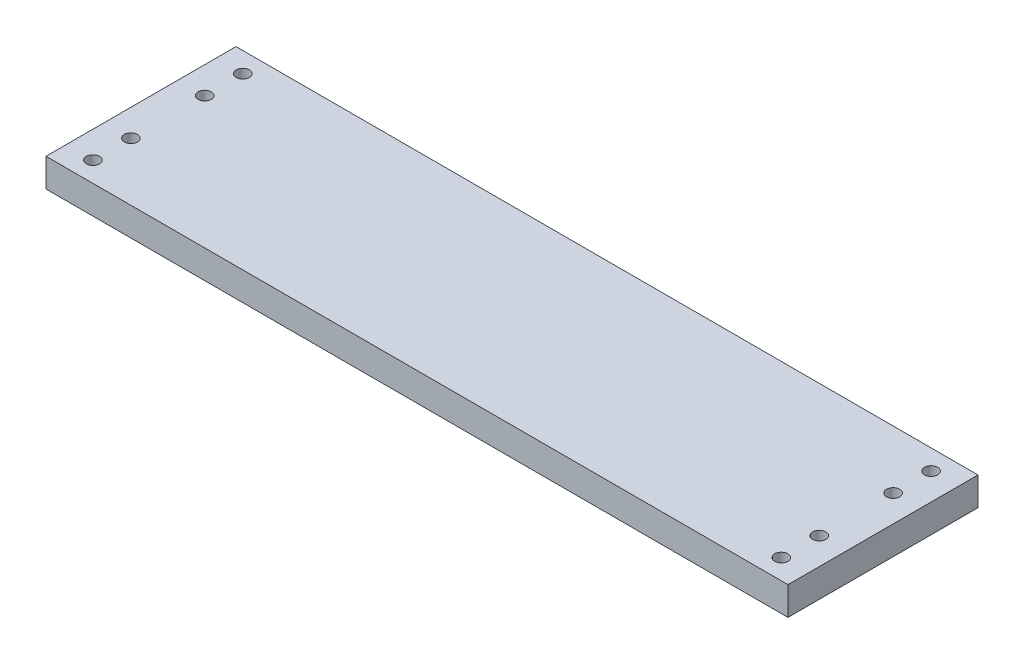
ISO-10303-21;
HEADER;
FILE_DESCRIPTION(('STEP AP214'),'2;1');
FILE_NAME('part.step','',(''),(''),'','','');
FILE_SCHEMA(('AUTOMOTIVE_DESIGN { 1 0 10303 214 1 1 1 1 }'));
ENDSEC;
DATA;
#1=APPLICATION_CONTEXT('core data for automotive mechanical design processes');
#2=APPLICATION_PROTOCOL_DEFINITION('international standard','automotive_design',2000,#1);
#3=PRODUCT_CONTEXT('',#1,'mechanical');
#4=PRODUCT('Part','Part','',(#3));
#5=PRODUCT_RELATED_PRODUCT_CATEGORY('part','',(#4));
#6=PRODUCT_DEFINITION_FORMATION('','',#4);
#7=PRODUCT_DEFINITION_CONTEXT('part definition',#1,'design');
#8=PRODUCT_DEFINITION('design','',#6,#7);
#9=PRODUCT_DEFINITION_SHAPE('','',#8);
#10=(LENGTH_UNIT() NAMED_UNIT(*) SI_UNIT(.MILLI.,.METRE.));
#11=(NAMED_UNIT(*) PLANE_ANGLE_UNIT() SI_UNIT($,.RADIAN.));
#12=(NAMED_UNIT(*) SI_UNIT($,.STERADIAN.) SOLID_ANGLE_UNIT());
#13=UNCERTAINTY_MEASURE_WITH_UNIT(LENGTH_MEASURE(1.E-05),#10,'distance_accuracy_value','');
#14=(GEOMETRIC_REPRESENTATION_CONTEXT(3) GLOBAL_UNCERTAINTY_ASSIGNED_CONTEXT((#13)) GLOBAL_UNIT_ASSIGNED_CONTEXT((#10,
#11,#12)) REPRESENTATION_CONTEXT('',''));
#15=CARTESIAN_POINT('',(0.,0.,0.));
#16=DIRECTION('',(0.,0.,1.));
#17=DIRECTION('',(1.,0.,0.));
#18=AXIS2_PLACEMENT_3D('',#15,#16,#17);
#19=CARTESIAN_POINT('',(-83.,6.35,-21.255));
#20=DIRECTION('',(0.,0.,-1.));
#21=DIRECTION('',(-1.,0.,0.));
#22=AXIS2_PLACEMENT_3D('',#19,#20,#21);
#23=PLANE('',#22);
#24=DIRECTION('',(1.,0.,0.));
#25=VECTOR('',#24,1.);
#26=CARTESIAN_POINT('',(-83.,0.,-21.255));
#27=LINE('',#26,#25);
#28=CARTESIAN_POINT('',(-83.,0.,-21.255));
#29=VERTEX_POINT('',#28);
#30=CARTESIAN_POINT('',(83.,0.,-21.255));
#31=VERTEX_POINT('',#30);
#32=EDGE_CURVE('E99',#29,#31,#27,.T.);
#33=ORIENTED_EDGE('',*,*,#32,.F.);
#34=DIRECTION('',(0.,-1.,0.));
#35=VECTOR('',#34,1.);
#36=CARTESIAN_POINT('',(-83.,6.35,-21.255));
#37=LINE('',#36,#35);
#38=CARTESIAN_POINT('',(-83.,6.35,-21.255));
#39=VERTEX_POINT('',#38);
#40=EDGE_CURVE('E11',#39,#29,#37,.T.);
#41=ORIENTED_EDGE('',*,*,#40,.F.);
#42=DIRECTION('',(1.,0.,0.));
#43=VECTOR('',#42,1.);
#44=CARTESIAN_POINT('',(-83.,6.35,-21.255));
#45=LINE('',#44,#43);
#46=CARTESIAN_POINT('',(83.,6.35,-21.255));
#47=VERTEX_POINT('',#46);
#48=EDGE_CURVE('E93',#39,#47,#45,.T.);
#49=ORIENTED_EDGE('',*,*,#48,.T.);
#50=DIRECTION('',(0.,-1.,0.));
#51=VECTOR('',#50,1.);
#52=CARTESIAN_POINT('',(83.,6.35,-21.255));
#53=LINE('',#52,#51);
#54=EDGE_CURVE('E36',#47,#31,#53,.T.);
#55=ORIENTED_EDGE('',*,*,#54,.T.);
#56=EDGE_LOOP('',(#33,#41,#49,#55));
#57=FACE_BOUND('',#56,.T.);
#58=ADVANCED_FACE('F33',(#57),#23,.T.);
#59=CARTESIAN_POINT('',(-83.,6.35,-21.255));
#60=DIRECTION('',(1.,0.,0.));
#61=DIRECTION('',(0.,0.,-1.));
#62=AXIS2_PLACEMENT_3D('',#59,#60,#61);
#63=PLANE('',#62);
#64=DIRECTION('',(0.,0.,1.));
#65=VECTOR('',#64,1.);
#66=CARTESIAN_POINT('',(-83.,0.,-21.255));
#67=LINE('',#66,#65);
#68=CARTESIAN_POINT('',(-83.,0.,21.255));
#69=VERTEX_POINT('',#68);
#70=EDGE_CURVE('E66',#29,#69,#67,.T.);
#71=ORIENTED_EDGE('',*,*,#70,.T.);
#72=DIRECTION('',(0.,-1.,0.));
#73=VECTOR('',#72,1.);
#74=CARTESIAN_POINT('',(-83.,6.35,21.255));
#75=LINE('',#74,#73);
#76=CARTESIAN_POINT('',(-83.,6.35,21.255));
#77=VERTEX_POINT('',#76);
#78=EDGE_CURVE('E42',#77,#69,#75,.T.);
#79=ORIENTED_EDGE('',*,*,#78,.F.);
#80=DIRECTION('',(0.,0.,1.));
#81=VECTOR('',#80,1.);
#82=CARTESIAN_POINT('',(-83.,6.35,-21.255));
#83=LINE('',#82,#81);
#84=EDGE_CURVE('E83',#39,#77,#83,.T.);
#85=ORIENTED_EDGE('',*,*,#84,.F.);
#86=ORIENTED_EDGE('',*,*,#40,.T.);
#87=EDGE_LOOP('',(#71,#79,#85,#86));
#88=FACE_BOUND('',#87,.T.);
#89=ADVANCED_FACE('F110',(#88),#63,.F.);
#90=CARTESIAN_POINT('',(-83.,6.35,21.255));
#91=DIRECTION('',(0.,0.,-1.));
#92=DIRECTION('',(-1.,0.,0.));
#93=AXIS2_PLACEMENT_3D('',#90,#91,#92);
#94=PLANE('',#93);
#95=DIRECTION('',(1.,0.,0.));
#96=VECTOR('',#95,1.);
#97=CARTESIAN_POINT('',(-83.,0.,21.255));
#98=LINE('',#97,#96);
#99=CARTESIAN_POINT('',(83.,0.,21.255));
#100=VERTEX_POINT('',#99);
#101=EDGE_CURVE('E90',#69,#100,#98,.T.);
#102=ORIENTED_EDGE('',*,*,#101,.T.);
#103=DIRECTION('',(0.,-1.,0.));
#104=VECTOR('',#103,1.);
#105=CARTESIAN_POINT('',(83.,6.35,21.255));
#106=LINE('',#105,#104);
#107=CARTESIAN_POINT('',(83.,6.35,21.255));
#108=VERTEX_POINT('',#107);
#109=EDGE_CURVE('E87',#108,#100,#106,.T.);
#110=ORIENTED_EDGE('',*,*,#109,.F.);
#111=DIRECTION('',(1.,0.,0.));
#112=VECTOR('',#111,1.);
#113=CARTESIAN_POINT('',(-83.,6.35,21.255));
#114=LINE('',#113,#112);
#115=EDGE_CURVE('E78',#77,#108,#114,.T.);
#116=ORIENTED_EDGE('',*,*,#115,.F.);
#117=ORIENTED_EDGE('',*,*,#78,.T.);
#118=EDGE_LOOP('',(#102,#110,#116,#117));
#119=FACE_BOUND('',#118,.T.);
#120=ADVANCED_FACE('F88',(#119),#94,.F.);
#121=CARTESIAN_POINT('',(83.,6.35,-21.255));
#122=DIRECTION('',(1.,0.,0.));
#123=DIRECTION('',(0.,0.,-1.));
#124=AXIS2_PLACEMENT_3D('',#121,#122,#123);
#125=PLANE('',#124);
#126=DIRECTION('',(0.,0.,1.));
#127=VECTOR('',#126,1.);
#128=CARTESIAN_POINT('',(83.,0.,-21.255));
#129=LINE('',#128,#127);
#130=EDGE_CURVE('E102',#31,#100,#129,.T.);
#131=ORIENTED_EDGE('',*,*,#130,.F.);
#132=ORIENTED_EDGE('',*,*,#54,.F.);
#133=DIRECTION('',(0.,0.,1.));
#134=VECTOR('',#133,1.);
#135=CARTESIAN_POINT('',(83.,6.35,-21.255));
#136=LINE('',#135,#134);
#137=EDGE_CURVE('E82',#47,#108,#136,.T.);
#138=ORIENTED_EDGE('',*,*,#137,.T.);
#139=ORIENTED_EDGE('',*,*,#109,.T.);
#140=EDGE_LOOP('',(#131,#132,#138,#139));
#141=FACE_BOUND('',#140,.T.);
#142=ADVANCED_FACE('F92',(#141),#125,.T.);
#143=CARTESIAN_POINT('',(0.,6.35,0.));
#144=DIRECTION('',(0.,-1.,0.));
#145=DIRECTION('',(0.,0.,-1.));
#146=AXIS2_PLACEMENT_3D('',#143,#144,#145);
#147=PLANE('',#146);
#148=CARTESIAN_POINT('',(-77.,6.35,8.25499999999999));
#149=DIRECTION('',(0.,-1.,0.));
#150=DIRECTION('',(0.,0.,-1.));
#151=AXIS2_PLACEMENT_3D('',#148,#149,#150);
#152=CIRCLE('',#151,1.47319999999999);
#153=CARTESIAN_POINT('',(-77.,6.35,6.7818));
#154=VERTEX_POINT('',#153);
#155=EDGE_CURVE('E206',#154,#154,#152,.T.);
#156=ORIENTED_EDGE('',*,*,#155,.T.);
#157=EDGE_LOOP('',(#156));
#158=FACE_BOUND('',#157,.T.);
#159=CARTESIAN_POINT('',(-77.,6.35,16.755));
#160=DIRECTION('',(0.,-1.,0.));
#161=DIRECTION('',(0.,0.,-1.));
#162=AXIS2_PLACEMENT_3D('',#159,#160,#161);
#163=CIRCLE('',#162,1.47319999999999);
#164=CARTESIAN_POINT('',(-77.,6.35,15.2818));
#165=VERTEX_POINT('',#164);
#166=EDGE_CURVE('E216',#165,#165,#163,.T.);
#167=ORIENTED_EDGE('',*,*,#166,.T.);
#168=EDGE_LOOP('',(#167));
#169=FACE_BOUND('',#168,.T.);
#170=CARTESIAN_POINT('',(77.,6.35,8.25500000000001));
#171=DIRECTION('',(0.,-1.,0.));
#172=DIRECTION('',(0.,0.,-1.));
#173=AXIS2_PLACEMENT_3D('',#170,#171,#172);
#174=CIRCLE('',#173,1.47319999999999);
#175=CARTESIAN_POINT('',(77.,6.35,6.78180000000001));
#176=VERTEX_POINT('',#175);
#177=EDGE_CURVE('E225',#176,#176,#174,.T.);
#178=ORIENTED_EDGE('',*,*,#177,.T.);
#179=EDGE_LOOP('',(#178));
#180=FACE_BOUND('',#179,.T.);
#181=CARTESIAN_POINT('',(77.,6.35,16.755));
#182=DIRECTION('',(0.,-1.,0.));
#183=DIRECTION('',(0.,0.,-1.));
#184=AXIS2_PLACEMENT_3D('',#181,#182,#183);
#185=CIRCLE('',#184,1.47319999999999);
#186=CARTESIAN_POINT('',(77.,6.35,15.2818));
#187=VERTEX_POINT('',#186);
#188=EDGE_CURVE('E234',#187,#187,#185,.T.);
#189=ORIENTED_EDGE('',*,*,#188,.T.);
#190=EDGE_LOOP('',(#189));
#191=FACE_BOUND('',#190,.T.);
#192=CARTESIAN_POINT('',(-77.,6.35,-8.25499999999999));
#193=DIRECTION('',(0.,1.,0.));
#194=DIRECTION('',(0.,0.,1.));
#195=AXIS2_PLACEMENT_3D('',#192,#193,#194);
#196=CIRCLE('',#195,1.47319999999999);
#197=CARTESIAN_POINT('',(-77.,6.35,-6.7818));
#198=VERTEX_POINT('',#197);
#199=EDGE_CURVE('E261',#198,#198,#196,.T.);
#200=ORIENTED_EDGE('',*,*,#199,.F.);
#201=EDGE_LOOP('',(#200));
#202=FACE_BOUND('',#201,.T.);
#203=CARTESIAN_POINT('',(-77.,6.35,-16.755));
#204=DIRECTION('',(0.,1.,0.));
#205=DIRECTION('',(0.,0.,1.));
#206=AXIS2_PLACEMENT_3D('',#203,#204,#205);
#207=CIRCLE('',#206,1.47319999999999);
#208=CARTESIAN_POINT('',(-77.,6.35,-15.2818));
#209=VERTEX_POINT('',#208);
#210=EDGE_CURVE('E264',#209,#209,#207,.T.);
#211=ORIENTED_EDGE('',*,*,#210,.F.);
#212=EDGE_LOOP('',(#211));
#213=FACE_BOUND('',#212,.T.);
#214=CARTESIAN_POINT('',(77.,6.35,-8.25500000000001));
#215=DIRECTION('',(0.,1.,0.));
#216=DIRECTION('',(0.,0.,1.));
#217=AXIS2_PLACEMENT_3D('',#214,#215,#216);
#218=CIRCLE('',#217,1.47319999999999);
#219=CARTESIAN_POINT('',(77.,6.35,-6.78180000000001));
#220=VERTEX_POINT('',#219);
#221=EDGE_CURVE('E267',#220,#220,#218,.T.);
#222=ORIENTED_EDGE('',*,*,#221,.F.);
#223=EDGE_LOOP('',(#222));
#224=FACE_BOUND('',#223,.T.);
#225=CARTESIAN_POINT('',(77.,6.35,-16.755));
#226=DIRECTION('',(0.,1.,0.));
#227=DIRECTION('',(0.,0.,1.));
#228=AXIS2_PLACEMENT_3D('',#225,#226,#227);
#229=CIRCLE('',#228,1.47319999999999);
#230=CARTESIAN_POINT('',(77.,6.35,-15.2818));
#231=VERTEX_POINT('',#230);
#232=EDGE_CURVE('E103',#231,#231,#229,.T.);
#233=ORIENTED_EDGE('',*,*,#232,.F.);
#234=EDGE_LOOP('',(#233));
#235=FACE_BOUND('',#234,.T.);
#236=ORIENTED_EDGE('',*,*,#48,.F.);
#237=ORIENTED_EDGE('',*,*,#84,.T.);
#238=ORIENTED_EDGE('',*,*,#115,.T.);
#239=ORIENTED_EDGE('',*,*,#137,.F.);
#240=EDGE_LOOP('',(#236,#237,#238,#239));
#241=FACE_BOUND('',#240,.T.);
#242=ADVANCED_FACE('F81',(#158,#169,#180,#191,#202,#213,#224,#235,#241),#147,.F.);
#243=CARTESIAN_POINT('',(0.,0.,0.));
#244=DIRECTION('',(0.,-1.,0.));
#245=DIRECTION('',(0.,0.,-1.));
#246=AXIS2_PLACEMENT_3D('',#243,#244,#245);
#247=PLANE('',#246);
#248=CARTESIAN_POINT('',(-77.,0.,8.25499999999999));
#249=DIRECTION('',(0.,-1.,0.));
#250=DIRECTION('',(0.,0.,-1.));
#251=AXIS2_PLACEMENT_3D('',#248,#249,#250);
#252=CIRCLE('',#251,3.4558351);
#253=CARTESIAN_POINT('',(-77.,0.,4.79916489999999));
#254=VERTEX_POINT('',#253);
#255=EDGE_CURVE('E204',#254,#254,#252,.T.);
#256=ORIENTED_EDGE('',*,*,#255,.F.);
#257=EDGE_LOOP('',(#256));
#258=FACE_BOUND('',#257,.T.);
#259=CARTESIAN_POINT('',(-77.,0.,16.755));
#260=DIRECTION('',(0.,-1.,0.));
#261=DIRECTION('',(0.,0.,-1.));
#262=AXIS2_PLACEMENT_3D('',#259,#260,#261);
#263=CIRCLE('',#262,3.4558351);
#264=CARTESIAN_POINT('',(-77.,0.,13.2991649));
#265=VERTEX_POINT('',#264);
#266=EDGE_CURVE('E210',#265,#265,#263,.T.);
#267=ORIENTED_EDGE('',*,*,#266,.F.);
#268=EDGE_LOOP('',(#267));
#269=FACE_BOUND('',#268,.T.);
#270=CARTESIAN_POINT('',(77.,0.,8.25500000000001));
#271=DIRECTION('',(0.,-1.,0.));
#272=DIRECTION('',(0.,0.,-1.));
#273=AXIS2_PLACEMENT_3D('',#270,#271,#272);
#274=CIRCLE('',#273,3.4558351);
#275=CARTESIAN_POINT('',(77.,0.,4.79916490000001));
#276=VERTEX_POINT('',#275);
#277=EDGE_CURVE('E219',#276,#276,#274,.T.);
#278=ORIENTED_EDGE('',*,*,#277,.F.);
#279=EDGE_LOOP('',(#278));
#280=FACE_BOUND('',#279,.T.);
#281=CARTESIAN_POINT('',(77.,0.,16.755));
#282=DIRECTION('',(0.,-1.,0.));
#283=DIRECTION('',(0.,0.,-1.));
#284=AXIS2_PLACEMENT_3D('',#281,#282,#283);
#285=CIRCLE('',#284,3.4558351);
#286=CARTESIAN_POINT('',(77.,0.,13.2991649));
#287=VERTEX_POINT('',#286);
#288=EDGE_CURVE('E228',#287,#287,#285,.T.);
#289=ORIENTED_EDGE('',*,*,#288,.F.);
#290=EDGE_LOOP('',(#289));
#291=FACE_BOUND('',#290,.T.);
#292=CARTESIAN_POINT('',(-77.,0.,-8.25499999999999));
#293=DIRECTION('',(0.,-1.,0.));
#294=DIRECTION('',(0.,0.,-1.));
#295=AXIS2_PLACEMENT_3D('',#292,#293,#294);
#296=CIRCLE('',#295,3.4558351);
#297=CARTESIAN_POINT('',(-77.,0.,-11.7108351));
#298=VERTEX_POINT('',#297);
#299=EDGE_CURVE('E237',#298,#298,#296,.T.);
#300=ORIENTED_EDGE('',*,*,#299,.F.);
#301=EDGE_LOOP('',(#300));
#302=FACE_BOUND('',#301,.T.);
#303=CARTESIAN_POINT('',(-77.,0.,-16.755));
#304=DIRECTION('',(0.,-1.,0.));
#305=DIRECTION('',(0.,0.,-1.));
#306=AXIS2_PLACEMENT_3D('',#303,#304,#305);
#307=CIRCLE('',#306,3.4558351);
#308=CARTESIAN_POINT('',(-77.,0.,-20.2108351));
#309=VERTEX_POINT('',#308);
#310=EDGE_CURVE('E243',#309,#309,#307,.T.);
#311=ORIENTED_EDGE('',*,*,#310,.F.);
#312=EDGE_LOOP('',(#311));
#313=FACE_BOUND('',#312,.T.);
#314=CARTESIAN_POINT('',(77.,0.,-8.25500000000001));
#315=DIRECTION('',(0.,-1.,0.));
#316=DIRECTION('',(0.,0.,-1.));
#317=AXIS2_PLACEMENT_3D('',#314,#315,#316);
#318=CIRCLE('',#317,3.4558351);
#319=CARTESIAN_POINT('',(77.,0.,-11.7108351));
#320=VERTEX_POINT('',#319);
#321=EDGE_CURVE('E249',#320,#320,#318,.T.);
#322=ORIENTED_EDGE('',*,*,#321,.F.);
#323=EDGE_LOOP('',(#322));
#324=FACE_BOUND('',#323,.T.);
#325=CARTESIAN_POINT('',(77.,0.,-16.755));
#326=DIRECTION('',(0.,-1.,0.));
#327=DIRECTION('',(0.,0.,-1.));
#328=AXIS2_PLACEMENT_3D('',#325,#326,#327);
#329=CIRCLE('',#328,3.4558351);
#330=CARTESIAN_POINT('',(77.,0.,-20.2108351));
#331=VERTEX_POINT('',#330);
#332=EDGE_CURVE('E255',#331,#331,#329,.T.);
#333=ORIENTED_EDGE('',*,*,#332,.F.);
#334=EDGE_LOOP('',(#333));
#335=FACE_BOUND('',#334,.T.);
#336=ORIENTED_EDGE('',*,*,#32,.T.);
#337=ORIENTED_EDGE('',*,*,#130,.T.);
#338=ORIENTED_EDGE('',*,*,#101,.F.);
#339=ORIENTED_EDGE('',*,*,#70,.F.);
#340=EDGE_LOOP('',(#336,#337,#338,#339));
#341=FACE_BOUND('',#340,.T.);
#342=ADVANCED_FACE('F108',(#258,#269,#280,#291,#302,#313,#324,#335,#341),#247,.T.);
#343=CARTESIAN_POINT('',(77.,6.35,-16.755));
#344=DIRECTION('',(0.,1.,0.));
#345=DIRECTION('',(0.,0.,1.));
#346=AXIS2_PLACEMENT_3D('',#343,#344,#345);
#347=CYLINDRICAL_SURFACE('',#346,1.47319999999999);
#348=CARTESIAN_POINT('',(77.,2.28076078208747,-16.755));
#349=DIRECTION('',(0.,-1.,0.));
#350=DIRECTION('',(0.,0.,-1.));
#351=AXIS2_PLACEMENT_3D('',#348,#349,#350);
#352=CIRCLE('',#351,1.47319999999999);
#353=CARTESIAN_POINT('',(77.,2.28076078208747,-18.2282));
#354=VERTEX_POINT('',#353);
#355=EDGE_CURVE('E258',#354,#354,#352,.T.);
#356=ORIENTED_EDGE('',*,*,#355,.T.);
#357=EDGE_LOOP('',(#356));
#358=FACE_BOUND('',#357,.T.);
#359=ORIENTED_EDGE('',*,*,#232,.T.);
#360=EDGE_LOOP('',(#359));
#361=FACE_BOUND('',#360,.T.);
#362=ADVANCED_FACE('F129',(#358,#361),#347,.F.);
#363=CARTESIAN_POINT('',(77.,6.35,-8.25500000000001));
#364=DIRECTION('',(0.,1.,0.));
#365=DIRECTION('',(0.,0.,1.));
#366=AXIS2_PLACEMENT_3D('',#363,#364,#365);
#367=CYLINDRICAL_SURFACE('',#366,1.47319999999999);
#368=CARTESIAN_POINT('',(77.,2.28076078208747,-8.25500000000001));
#369=DIRECTION('',(0.,-1.,0.));
#370=DIRECTION('',(0.,0.,-1.));
#371=AXIS2_PLACEMENT_3D('',#368,#369,#370);
#372=CIRCLE('',#371,1.47319999999999);
#373=CARTESIAN_POINT('',(77.,2.28076078208747,-9.7282));
#374=VERTEX_POINT('',#373);
#375=EDGE_CURVE('E252',#374,#374,#372,.T.);
#376=ORIENTED_EDGE('',*,*,#375,.T.);
#377=EDGE_LOOP('',(#376));
#378=FACE_BOUND('',#377,.T.);
#379=ORIENTED_EDGE('',*,*,#221,.T.);
#380=EDGE_LOOP('',(#379));
#381=FACE_BOUND('',#380,.T.);
#382=ADVANCED_FACE('F136',(#378,#381),#367,.F.);
#383=CARTESIAN_POINT('',(-77.,6.35,-16.755));
#384=DIRECTION('',(0.,1.,0.));
#385=DIRECTION('',(0.,0.,1.));
#386=AXIS2_PLACEMENT_3D('',#383,#384,#385);
#387=CYLINDRICAL_SURFACE('',#386,1.47319999999999);
#388=CARTESIAN_POINT('',(-77.,2.28076078208747,-16.755));
#389=DIRECTION('',(0.,-1.,0.));
#390=DIRECTION('',(0.,0.,-1.));
#391=AXIS2_PLACEMENT_3D('',#388,#389,#390);
#392=CIRCLE('',#391,1.47319999999999);
#393=CARTESIAN_POINT('',(-77.,2.28076078208747,-18.2282));
#394=VERTEX_POINT('',#393);
#395=EDGE_CURVE('E246',#394,#394,#392,.T.);
#396=ORIENTED_EDGE('',*,*,#395,.T.);
#397=EDGE_LOOP('',(#396));
#398=FACE_BOUND('',#397,.T.);
#399=ORIENTED_EDGE('',*,*,#210,.T.);
#400=EDGE_LOOP('',(#399));
#401=FACE_BOUND('',#400,.T.);
#402=ADVANCED_FACE('F140',(#398,#401),#387,.F.);
#403=CARTESIAN_POINT('',(-77.,6.35,-8.25499999999999));
#404=DIRECTION('',(0.,1.,0.));
#405=DIRECTION('',(0.,0.,1.));
#406=AXIS2_PLACEMENT_3D('',#403,#404,#405);
#407=CYLINDRICAL_SURFACE('',#406,1.47319999999999);
#408=CARTESIAN_POINT('',(-77.,2.28076078208747,-8.25499999999999));
#409=DIRECTION('',(0.,-1.,0.));
#410=DIRECTION('',(0.,0.,-1.));
#411=AXIS2_PLACEMENT_3D('',#408,#409,#410);
#412=CIRCLE('',#411,1.47319999999999);
#413=CARTESIAN_POINT('',(-77.,2.28076078208747,-9.72819999999999));
#414=VERTEX_POINT('',#413);
#415=EDGE_CURVE('E240',#414,#414,#412,.T.);
#416=ORIENTED_EDGE('',*,*,#415,.T.);
#417=EDGE_LOOP('',(#416));
#418=FACE_BOUND('',#417,.T.);
#419=ORIENTED_EDGE('',*,*,#199,.T.);
#420=EDGE_LOOP('',(#419));
#421=FACE_BOUND('',#420,.T.);
#422=ADVANCED_FACE('F144',(#418,#421),#407,.F.);
#423=CARTESIAN_POINT('',(77.,0.,-16.755));
#424=DIRECTION('',(0.,-1.,0.));
#425=DIRECTION('',(0.,0.,-1.));
#426=AXIS2_PLACEMENT_3D('',#423,#424,#425);
#427=CONICAL_SURFACE('',#426,3.4558351,0.715584993317677);
#428=ORIENTED_EDGE('',*,*,#355,.F.);
#429=EDGE_LOOP('',(#428));
#430=FACE_BOUND('',#429,.T.);
#431=ORIENTED_EDGE('',*,*,#332,.T.);
#432=EDGE_LOOP('',(#431));
#433=FACE_BOUND('',#432,.T.);
#434=ADVANCED_FACE('F148',(#430,#433),#427,.F.);
#435=CARTESIAN_POINT('',(77.,0.,-8.25500000000001));
#436=DIRECTION('',(0.,-1.,0.));
#437=DIRECTION('',(0.,0.,-1.));
#438=AXIS2_PLACEMENT_3D('',#435,#436,#437);
#439=CONICAL_SURFACE('',#438,3.4558351,0.715584993317677);
#440=ORIENTED_EDGE('',*,*,#375,.F.);
#441=EDGE_LOOP('',(#440));
#442=FACE_BOUND('',#441,.T.);
#443=ORIENTED_EDGE('',*,*,#321,.T.);
#444=EDGE_LOOP('',(#443));
#445=FACE_BOUND('',#444,.T.);
#446=ADVANCED_FACE('F152',(#442,#445),#439,.F.);
#447=CARTESIAN_POINT('',(-77.,0.,-16.755));
#448=DIRECTION('',(0.,-1.,0.));
#449=DIRECTION('',(0.,0.,-1.));
#450=AXIS2_PLACEMENT_3D('',#447,#448,#449);
#451=CONICAL_SURFACE('',#450,3.4558351,0.715584993317677);
#452=ORIENTED_EDGE('',*,*,#395,.F.);
#453=EDGE_LOOP('',(#452));
#454=FACE_BOUND('',#453,.T.);
#455=ORIENTED_EDGE('',*,*,#310,.T.);
#456=EDGE_LOOP('',(#455));
#457=FACE_BOUND('',#456,.T.);
#458=ADVANCED_FACE('F156',(#454,#457),#451,.F.);
#459=CARTESIAN_POINT('',(-77.,0.,-8.25499999999999));
#460=DIRECTION('',(0.,-1.,0.));
#461=DIRECTION('',(0.,0.,-1.));
#462=AXIS2_PLACEMENT_3D('',#459,#460,#461);
#463=CONICAL_SURFACE('',#462,3.4558351,0.715584993317677);
#464=ORIENTED_EDGE('',*,*,#415,.F.);
#465=EDGE_LOOP('',(#464));
#466=FACE_BOUND('',#465,.T.);
#467=ORIENTED_EDGE('',*,*,#299,.T.);
#468=EDGE_LOOP('',(#467));
#469=FACE_BOUND('',#468,.T.);
#470=ADVANCED_FACE('F160',(#466,#469),#463,.F.);
#471=CARTESIAN_POINT('',(77.,0.,16.755));
#472=DIRECTION('',(0.,-1.,0.));
#473=DIRECTION('',(0.,0.,-1.));
#474=AXIS2_PLACEMENT_3D('',#471,#472,#473);
#475=CYLINDRICAL_SURFACE('',#474,1.47319999999999);
#476=ORIENTED_EDGE('',*,*,#188,.F.);
#477=EDGE_LOOP('',(#476));
#478=FACE_BOUND('',#477,.T.);
#479=CARTESIAN_POINT('',(77.,2.28076078208747,16.755));
#480=DIRECTION('',(0.,-1.,0.));
#481=DIRECTION('',(0.,0.,-1.));
#482=AXIS2_PLACEMENT_3D('',#479,#480,#481);
#483=CIRCLE('',#482,1.47319999999999);
#484=CARTESIAN_POINT('',(77.,2.28076078208747,15.2818));
#485=VERTEX_POINT('',#484);
#486=EDGE_CURVE('E231',#485,#485,#483,.T.);
#487=ORIENTED_EDGE('',*,*,#486,.T.);
#488=EDGE_LOOP('',(#487));
#489=FACE_BOUND('',#488,.T.);
#490=ADVANCED_FACE('F164',(#478,#489),#475,.F.);
#491=CARTESIAN_POINT('',(77.,0.,16.755));
#492=DIRECTION('',(0.,-1.,0.));
#493=DIRECTION('',(0.,0.,-1.));
#494=AXIS2_PLACEMENT_3D('',#491,#492,#493);
#495=CONICAL_SURFACE('',#494,3.4558351,0.715584993317677);
#496=ORIENTED_EDGE('',*,*,#486,.F.);
#497=EDGE_LOOP('',(#496));
#498=FACE_BOUND('',#497,.T.);
#499=ORIENTED_EDGE('',*,*,#288,.T.);
#500=EDGE_LOOP('',(#499));
#501=FACE_BOUND('',#500,.T.);
#502=ADVANCED_FACE('F168',(#498,#501),#495,.F.);
#503=CARTESIAN_POINT('',(77.,0.,8.25500000000001));
#504=DIRECTION('',(0.,-1.,0.));
#505=DIRECTION('',(0.,0.,-1.));
#506=AXIS2_PLACEMENT_3D('',#503,#504,#505);
#507=CYLINDRICAL_SURFACE('',#506,1.47319999999999);
#508=ORIENTED_EDGE('',*,*,#177,.F.);
#509=EDGE_LOOP('',(#508));
#510=FACE_BOUND('',#509,.T.);
#511=CARTESIAN_POINT('',(77.,2.28076078208747,8.25500000000001));
#512=DIRECTION('',(0.,-1.,0.));
#513=DIRECTION('',(0.,0.,-1.));
#514=AXIS2_PLACEMENT_3D('',#511,#512,#513);
#515=CIRCLE('',#514,1.47319999999999);
#516=CARTESIAN_POINT('',(77.,2.28076078208747,6.78180000000001));
#517=VERTEX_POINT('',#516);
#518=EDGE_CURVE('E222',#517,#517,#515,.T.);
#519=ORIENTED_EDGE('',*,*,#518,.T.);
#520=EDGE_LOOP('',(#519));
#521=FACE_BOUND('',#520,.T.);
#522=ADVANCED_FACE('F172',(#510,#521),#507,.F.);
#523=CARTESIAN_POINT('',(77.,0.,8.25500000000001));
#524=DIRECTION('',(0.,-1.,0.));
#525=DIRECTION('',(0.,0.,-1.));
#526=AXIS2_PLACEMENT_3D('',#523,#524,#525);
#527=CONICAL_SURFACE('',#526,3.4558351,0.715584993317677);
#528=ORIENTED_EDGE('',*,*,#518,.F.);
#529=EDGE_LOOP('',(#528));
#530=FACE_BOUND('',#529,.T.);
#531=ORIENTED_EDGE('',*,*,#277,.T.);
#532=EDGE_LOOP('',(#531));
#533=FACE_BOUND('',#532,.T.);
#534=ADVANCED_FACE('F176',(#530,#533),#527,.F.);
#535=CARTESIAN_POINT('',(-77.,0.,16.755));
#536=DIRECTION('',(0.,-1.,0.));
#537=DIRECTION('',(0.,0.,-1.));
#538=AXIS2_PLACEMENT_3D('',#535,#536,#537);
#539=CYLINDRICAL_SURFACE('',#538,1.47319999999999);
#540=ORIENTED_EDGE('',*,*,#166,.F.);
#541=EDGE_LOOP('',(#540));
#542=FACE_BOUND('',#541,.T.);
#543=CARTESIAN_POINT('',(-77.,2.28076078208747,16.755));
#544=DIRECTION('',(0.,-1.,0.));
#545=DIRECTION('',(0.,0.,-1.));
#546=AXIS2_PLACEMENT_3D('',#543,#544,#545);
#547=CIRCLE('',#546,1.47319999999999);
#548=CARTESIAN_POINT('',(-77.,2.28076078208747,15.2818));
#549=VERTEX_POINT('',#548);
#550=EDGE_CURVE('E213',#549,#549,#547,.T.);
#551=ORIENTED_EDGE('',*,*,#550,.T.);
#552=EDGE_LOOP('',(#551));
#553=FACE_BOUND('',#552,.T.);
#554=ADVANCED_FACE('F180',(#542,#553),#539,.F.);
#555=CARTESIAN_POINT('',(-77.,0.,16.755));
#556=DIRECTION('',(0.,-1.,0.));
#557=DIRECTION('',(0.,0.,-1.));
#558=AXIS2_PLACEMENT_3D('',#555,#556,#557);
#559=CONICAL_SURFACE('',#558,3.4558351,0.715584993317677);
#560=ORIENTED_EDGE('',*,*,#550,.F.);
#561=EDGE_LOOP('',(#560));
#562=FACE_BOUND('',#561,.T.);
#563=ORIENTED_EDGE('',*,*,#266,.T.);
#564=EDGE_LOOP('',(#563));
#565=FACE_BOUND('',#564,.T.);
#566=ADVANCED_FACE('F184',(#562,#565),#559,.F.);
#567=CARTESIAN_POINT('',(-77.,0.,8.25499999999999));
#568=DIRECTION('',(0.,-1.,0.));
#569=DIRECTION('',(0.,0.,-1.));
#570=AXIS2_PLACEMENT_3D('',#567,#568,#569);
#571=CYLINDRICAL_SURFACE('',#570,1.47319999999999);
#572=ORIENTED_EDGE('',*,*,#155,.F.);
#573=EDGE_LOOP('',(#572));
#574=FACE_BOUND('',#573,.T.);
#575=CARTESIAN_POINT('',(-77.,2.28076078208747,8.25499999999999));
#576=DIRECTION('',(0.,-1.,0.));
#577=DIRECTION('',(0.,0.,-1.));
#578=AXIS2_PLACEMENT_3D('',#575,#576,#577);
#579=CIRCLE('',#578,1.47319999999999);
#580=CARTESIAN_POINT('',(-77.,2.28076078208747,6.7818));
#581=VERTEX_POINT('',#580);
#582=EDGE_CURVE('E201',#581,#581,#579,.T.);
#583=ORIENTED_EDGE('',*,*,#582,.T.);
#584=EDGE_LOOP('',(#583));
#585=FACE_BOUND('',#584,.T.);
#586=ADVANCED_FACE('F188',(#574,#585),#571,.F.);
#587=CARTESIAN_POINT('',(-77.,0.,8.25499999999999));
#588=DIRECTION('',(0.,-1.,0.));
#589=DIRECTION('',(0.,0.,-1.));
#590=AXIS2_PLACEMENT_3D('',#587,#588,#589);
#591=CONICAL_SURFACE('',#590,3.4558351,0.715584993317677);
#592=ORIENTED_EDGE('',*,*,#582,.F.);
#593=EDGE_LOOP('',(#592));
#594=FACE_BOUND('',#593,.T.);
#595=ORIENTED_EDGE('',*,*,#255,.T.);
#596=EDGE_LOOP('',(#595));
#597=FACE_BOUND('',#596,.T.);
#598=ADVANCED_FACE('F192',(#594,#597),#591,.F.);
#599=CLOSED_SHELL('',(#58,#89,#120,#142,#242,#342,#362,#382,#402,#422,#434,#446,#458,#470,#490,
#502,#522,#534,#554,#566,#586,#598));
#600=MANIFOLD_SOLID_BREP('B2',#599);
#601=ADVANCED_BREP_SHAPE_REPRESENTATION('',(#18,#600),#14);
#602=SHAPE_DEFINITION_REPRESENTATION(#9,#601);
ENDSEC;
END-ISO-10303-21;
